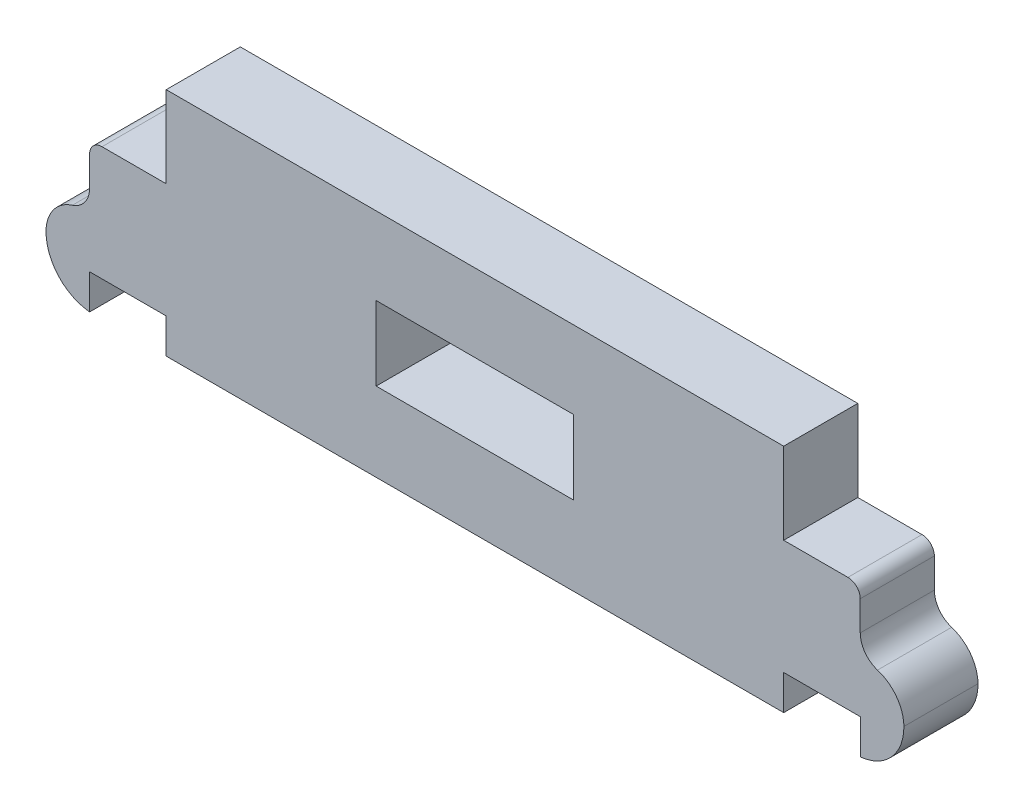
ISO-10303-21;
HEADER;
FILE_DESCRIPTION(('STEP AP214'),'2;1');
FILE_NAME('part.step','',(''),(''),'','','');
FILE_SCHEMA(('AUTOMOTIVE_DESIGN { 1 0 10303 214 1 1 1 1 }'));
ENDSEC;
DATA;
#1=APPLICATION_CONTEXT('core data for automotive mechanical design processes');
#2=APPLICATION_PROTOCOL_DEFINITION('international standard','automotive_design',2000,#1);
#3=PRODUCT_CONTEXT('',#1,'mechanical');
#4=PRODUCT('Part','Part','',(#3));
#5=PRODUCT_RELATED_PRODUCT_CATEGORY('part','',(#4));
#6=PRODUCT_DEFINITION_FORMATION('','',#4);
#7=PRODUCT_DEFINITION_CONTEXT('part definition',#1,'design');
#8=PRODUCT_DEFINITION('design','',#6,#7);
#9=PRODUCT_DEFINITION_SHAPE('','',#8);
#10=(LENGTH_UNIT() NAMED_UNIT(*) SI_UNIT(.MILLI.,.METRE.));
#11=(NAMED_UNIT(*) PLANE_ANGLE_UNIT() SI_UNIT($,.RADIAN.));
#12=(NAMED_UNIT(*) SI_UNIT($,.STERADIAN.) SOLID_ANGLE_UNIT());
#13=UNCERTAINTY_MEASURE_WITH_UNIT(LENGTH_MEASURE(1.E-05),#10,'distance_accuracy_value','');
#14=(GEOMETRIC_REPRESENTATION_CONTEXT(3) GLOBAL_UNCERTAINTY_ASSIGNED_CONTEXT((#13)) GLOBAL_UNIT_ASSIGNED_CONTEXT((#10,
#11,#12)) REPRESENTATION_CONTEXT('',''));
#15=CARTESIAN_POINT('',(0.,0.,0.));
#16=DIRECTION('',(0.,0.,1.));
#17=DIRECTION('',(1.,0.,0.));
#18=AXIS2_PLACEMENT_3D('',#15,#16,#17);
#19=CARTESIAN_POINT('',(1127.94350891643,1917.30650062035,-3.));
#20=DIRECTION('',(-1.,0.,0.));
#21=DIRECTION('',(0.,-1.,0.));
#22=AXIS2_PLACEMENT_3D('',#19,#20,#21);
#23=PLANE('',#22);
#24=DIRECTION('',(0.,-1.,0.));
#25=VECTOR('',#24,1.);
#26=CARTESIAN_POINT('',(1127.94350891643,1917.30650062035,0.));
#27=LINE('',#26,#25);
#28=CARTESIAN_POINT('',(1127.94350891643,1917.30650062035,0.));
#29=VERTEX_POINT('',#28);
#30=CARTESIAN_POINT('',(1127.94350891643,1914.00650062035,0.));
#31=VERTEX_POINT('',#30);
#32=EDGE_CURVE('E243',#29,#31,#27,.T.);
#33=ORIENTED_EDGE('',*,*,#32,.F.);
#34=DIRECTION('',(0.,0.,1.));
#35=VECTOR('',#34,1.);
#36=CARTESIAN_POINT('',(1127.94350891643,1917.30650062035,-3.));
#37=LINE('',#36,#35);
#38=CARTESIAN_POINT('',(1127.94350891643,1917.30650062035,-3.));
#39=VERTEX_POINT('',#38);
#40=EDGE_CURVE('E11',#39,#29,#37,.T.);
#41=ORIENTED_EDGE('',*,*,#40,.F.);
#42=DIRECTION('',(0.,-1.,0.));
#43=VECTOR('',#42,1.);
#44=CARTESIAN_POINT('',(1127.94350891643,1917.30650062035,-3.));
#45=LINE('',#44,#43);
#46=CARTESIAN_POINT('',(1127.94350891643,1914.00650062035,-3.));
#47=VERTEX_POINT('',#46);
#48=EDGE_CURVE('E247',#39,#47,#45,.T.);
#49=ORIENTED_EDGE('',*,*,#48,.T.);
#50=DIRECTION('',(0.,0.,1.));
#51=VECTOR('',#50,1.);
#52=CARTESIAN_POINT('',(1127.94350891643,1914.00650062035,-3.));
#53=LINE('',#52,#51);
#54=EDGE_CURVE('E40',#47,#31,#53,.T.);
#55=ORIENTED_EDGE('',*,*,#54,.T.);
#56=EDGE_LOOP('',(#33,#41,#49,#55));
#57=FACE_BOUND('',#56,.T.);
#58=ADVANCED_FACE('F37',(#57),#23,.T.);
#59=CARTESIAN_POINT('',(1127.94350891643,1917.30650062035,-3.));
#60=DIRECTION('',(0.,1.,0.));
#61=DIRECTION('',(-1.,0.,0.));
#62=AXIS2_PLACEMENT_3D('',#59,#60,#61);
#63=PLANE('',#62);
#64=DIRECTION('',(-1.,0.,0.));
#65=VECTOR('',#64,1.);
#66=CARTESIAN_POINT('',(1127.94350891643,1917.30650062035,0.));
#67=LINE('',#66,#65);
#68=CARTESIAN_POINT('',(1152.94350891643,1917.30650062035,0.));
#69=VERTEX_POINT('',#68);
#70=EDGE_CURVE('E251',#69,#29,#67,.T.);
#71=ORIENTED_EDGE('',*,*,#70,.F.);
#72=DIRECTION('',(0.,0.,1.));
#73=VECTOR('',#72,1.);
#74=CARTESIAN_POINT('',(1152.94350891643,1917.30650062035,-3.));
#75=LINE('',#74,#73);
#76=CARTESIAN_POINT('',(1152.94350891643,1917.30650062035,-3.));
#77=VERTEX_POINT('',#76);
#78=EDGE_CURVE('E45',#77,#69,#75,.T.);
#79=ORIENTED_EDGE('',*,*,#78,.F.);
#80=DIRECTION('',(-1.,0.,0.));
#81=VECTOR('',#80,1.);
#82=CARTESIAN_POINT('',(1127.94350891643,1917.30650062035,-3.));
#83=LINE('',#82,#81);
#84=EDGE_CURVE('E311',#77,#39,#83,.T.);
#85=ORIENTED_EDGE('',*,*,#84,.T.);
#86=ORIENTED_EDGE('',*,*,#40,.T.);
#87=EDGE_LOOP('',(#71,#79,#85,#86));
#88=FACE_BOUND('',#87,.T.);
#89=ADVANCED_FACE('F428',(#88),#63,.T.);
#90=CARTESIAN_POINT('',(1152.94350891643,1917.30650062035,-3.));
#91=DIRECTION('',(1.,0.,0.));
#92=DIRECTION('',(0.,0.,-1.));
#93=AXIS2_PLACEMENT_3D('',#90,#91,#92);
#94=PLANE('',#93);
#95=DIRECTION('',(0.,1.,0.));
#96=VECTOR('',#95,1.);
#97=CARTESIAN_POINT('',(1152.94350891643,1917.30650062035,0.));
#98=LINE('',#97,#96);
#99=CARTESIAN_POINT('',(1152.94350891643,1914.00650062035,0.));
#100=VERTEX_POINT('',#99);
#101=EDGE_CURVE('E373',#100,#69,#98,.T.);
#102=ORIENTED_EDGE('',*,*,#101,.F.);
#103=DIRECTION('',(0.,0.,1.));
#104=VECTOR('',#103,1.);
#105=CARTESIAN_POINT('',(1152.94350891643,1914.00650062035,-3.));
#106=LINE('',#105,#104);
#107=CARTESIAN_POINT('',(1152.94350891643,1914.00650062035,-3.));
#108=VERTEX_POINT('',#107);
#109=EDGE_CURVE('E379',#108,#100,#106,.T.);
#110=ORIENTED_EDGE('',*,*,#109,.F.);
#111=DIRECTION('',(0.,1.,0.));
#112=VECTOR('',#111,1.);
#113=CARTESIAN_POINT('',(1152.94350891643,1917.30650062035,-3.));
#114=LINE('',#113,#112);
#115=EDGE_CURVE('E308',#108,#77,#114,.T.);
#116=ORIENTED_EDGE('',*,*,#115,.T.);
#117=ORIENTED_EDGE('',*,*,#78,.T.);
#118=EDGE_LOOP('',(#102,#110,#116,#117));
#119=FACE_BOUND('',#118,.T.);
#120=ADVANCED_FACE('F503',(#119),#94,.T.);
#121=CARTESIAN_POINT('',(1152.94350891643,1914.00650062035,-3.));
#122=DIRECTION('',(0.,1.,0.));
#123=DIRECTION('',(0.,0.,1.));
#124=AXIS2_PLACEMENT_3D('',#121,#122,#123);
#125=PLANE('',#124);
#126=DIRECTION('',(-1.,0.,0.));
#127=VECTOR('',#126,1.);
#128=CARTESIAN_POINT('',(1152.94350891643,1914.00650062035,0.));
#129=LINE('',#128,#127);
#130=CARTESIAN_POINT('',(1155.54275991038,1914.00650062035,0.));
#131=VERTEX_POINT('',#130);
#132=EDGE_CURVE('E370',#131,#100,#129,.T.);
#133=ORIENTED_EDGE('',*,*,#132,.F.);
#134=DIRECTION('',(0.,0.,1.));
#135=VECTOR('',#134,1.);
#136=CARTESIAN_POINT('',(1155.54275991038,1914.00650062035,-3.));
#137=LINE('',#136,#135);
#138=CARTESIAN_POINT('',(1155.54275991038,1914.00650062035,-3.));
#139=VERTEX_POINT('',#138);
#140=EDGE_CURVE('E381',#139,#131,#137,.T.);
#141=ORIENTED_EDGE('',*,*,#140,.F.);
#142=DIRECTION('',(-1.,0.,0.));
#143=VECTOR('',#142,1.);
#144=CARTESIAN_POINT('',(1152.94350891643,1914.00650062035,-3.));
#145=LINE('',#144,#143);
#146=EDGE_CURVE('E305',#139,#108,#145,.T.);
#147=ORIENTED_EDGE('',*,*,#146,.T.);
#148=ORIENTED_EDGE('',*,*,#109,.T.);
#149=EDGE_LOOP('',(#133,#141,#147,#148));
#150=FACE_BOUND('',#149,.T.);
#151=ADVANCED_FACE('F501',(#150),#125,.T.);
#152=CARTESIAN_POINT('',(1155.54275991038,1913.50650062035,-3.));
#153=DIRECTION('',(0.,0.,1.));
#154=DIRECTION('',(1.,0.,0.));
#155=AXIS2_PLACEMENT_3D('',#152,#153,#154);
#156=CYLINDRICAL_SURFACE('',#155,0.499999999999945);
#157=CARTESIAN_POINT('',(1155.54275991038,1913.50650062035,0.));
#158=DIRECTION('',(0.,0.,1.));
#159=DIRECTION('',(-1.,0.,0.));
#160=AXIS2_PLACEMENT_3D('',#157,#158,#159);
#161=CIRCLE('',#160,0.499999999999945);
#162=CARTESIAN_POINT('',(1156.04275991038,1913.50650062035,0.));
#163=VERTEX_POINT('',#162);
#164=EDGE_CURVE('E367',#163,#131,#161,.T.);
#165=ORIENTED_EDGE('',*,*,#164,.F.);
#166=DIRECTION('',(0.,0.,1.));
#167=VECTOR('',#166,1.);
#168=CARTESIAN_POINT('',(1156.04275991038,1913.50650062035,-3.));
#169=LINE('',#168,#167);
#170=CARTESIAN_POINT('',(1156.04275991038,1913.50650062035,-3.));
#171=VERTEX_POINT('',#170);
#172=EDGE_CURVE('E383',#171,#163,#169,.T.);
#173=ORIENTED_EDGE('',*,*,#172,.F.);
#174=CARTESIAN_POINT('',(1155.54275991038,1913.50650062035,-3.));
#175=DIRECTION('',(0.,0.,1.));
#176=DIRECTION('',(-1.,0.,0.));
#177=AXIS2_PLACEMENT_3D('',#174,#175,#176);
#178=CIRCLE('',#177,0.499999999999945);
#179=EDGE_CURVE('E302',#171,#139,#178,.T.);
#180=ORIENTED_EDGE('',*,*,#179,.T.);
#181=ORIENTED_EDGE('',*,*,#140,.T.);
#182=EDGE_LOOP('',(#165,#173,#180,#181));
#183=FACE_BOUND('',#182,.T.);
#184=ADVANCED_FACE('F497',(#183),#156,.T.);
#185=CARTESIAN_POINT('',(1156.04275991038,1913.50650062035,-3.));
#186=DIRECTION('',(1.,0.,0.));
#187=DIRECTION('',(0.,0.,-1.));
#188=AXIS2_PLACEMENT_3D('',#185,#186,#187);
#189=PLANE('',#188);
#190=DIRECTION('',(0.,1.,0.));
#191=VECTOR('',#190,1.);
#192=CARTESIAN_POINT('',(1156.04275991038,1913.50650062035,0.));
#193=LINE('',#192,#191);
#194=CARTESIAN_POINT('',(1156.04275991038,1912.3090901289,0.));
#195=VERTEX_POINT('',#194);
#196=EDGE_CURVE('E364',#195,#163,#193,.T.);
#197=ORIENTED_EDGE('',*,*,#196,.F.);
#198=DIRECTION('',(0.,0.,1.));
#199=VECTOR('',#198,1.);
#200=CARTESIAN_POINT('',(1156.04275991038,1912.3090901289,-3.));
#201=LINE('',#200,#199);
#202=CARTESIAN_POINT('',(1156.04275991038,1912.3090901289,-3.));
#203=VERTEX_POINT('',#202);
#204=EDGE_CURVE('E385',#203,#195,#201,.T.);
#205=ORIENTED_EDGE('',*,*,#204,.F.);
#206=DIRECTION('',(0.,1.,0.));
#207=VECTOR('',#206,1.);
#208=CARTESIAN_POINT('',(1156.04275991038,1913.50650062035,-3.));
#209=LINE('',#208,#207);
#210=EDGE_CURVE('E299',#203,#171,#209,.T.);
#211=ORIENTED_EDGE('',*,*,#210,.T.);
#212=ORIENTED_EDGE('',*,*,#172,.T.);
#213=EDGE_LOOP('',(#197,#205,#211,#212));
#214=FACE_BOUND('',#213,.T.);
#215=ADVANCED_FACE('F493',(#214),#189,.T.);
#216=CARTESIAN_POINT('',(1157.04275991038,1912.3090901289,-3.));
#217=DIRECTION('',(0.,0.,1.));
#218=DIRECTION('',(1.,0.,0.));
#219=AXIS2_PLACEMENT_3D('',#216,#217,#218);
#220=CYLINDRICAL_SURFACE('',#219,1.);
#221=CARTESIAN_POINT('',(1157.04275991038,1912.3090901289,0.));
#222=DIRECTION('',(0.,0.,-1.));
#223=DIRECTION('',(1.,0.,0.));
#224=AXIS2_PLACEMENT_3D('',#221,#222,#223);
#225=CIRCLE('',#224,1.);
#226=CARTESIAN_POINT('',(1156.74243530139,1911.35525307298,0.));
#227=VERTEX_POINT('',#226);
#228=EDGE_CURVE('E361',#227,#195,#225,.T.);
#229=ORIENTED_EDGE('',*,*,#228,.F.);
#230=DIRECTION('',(0.,0.,1.));
#231=VECTOR('',#230,1.);
#232=CARTESIAN_POINT('',(1156.74243530139,1911.35525307298,-3.));
#233=LINE('',#232,#231);
#234=CARTESIAN_POINT('',(1156.74243530139,1911.35525307298,-3.));
#235=VERTEX_POINT('',#234);
#236=EDGE_CURVE('E387',#235,#227,#233,.T.);
#237=ORIENTED_EDGE('',*,*,#236,.F.);
#238=CARTESIAN_POINT('',(1157.04275991038,1912.3090901289,-3.));
#239=DIRECTION('',(0.,0.,-1.));
#240=DIRECTION('',(1.,0.,0.));
#241=AXIS2_PLACEMENT_3D('',#238,#239,#240);
#242=CIRCLE('',#241,1.);
#243=EDGE_CURVE('E296',#235,#203,#242,.T.);
#244=ORIENTED_EDGE('',*,*,#243,.T.);
#245=ORIENTED_EDGE('',*,*,#204,.T.);
#246=EDGE_LOOP('',(#229,#237,#244,#245));
#247=FACE_BOUND('',#246,.T.);
#248=ADVANCED_FACE('F489',(#247),#220,.F.);
#249=CARTESIAN_POINT('',(1156.28409963789,1909.89956969972,-3.));
#250=DIRECTION('',(0.,0.,1.));
#251=DIRECTION('',(1.,0.,0.));
#252=AXIS2_PLACEMENT_3D('',#249,#250,#251);
#253=CYLINDRICAL_SURFACE('',#252,1.52613422202469);
#254=CARTESIAN_POINT('',(1156.28409963789,1909.89956969972,0.));
#255=DIRECTION('',(0.,0.,1.));
#256=DIRECTION('',(-1.,0.,0.));
#257=AXIS2_PLACEMENT_3D('',#254,#255,#256);
#258=CIRCLE('',#257,1.52613422202469);
#259=CARTESIAN_POINT('',(1157.810195296,1909.91041893606,0.));
#260=VERTEX_POINT('',#259);
#261=EDGE_CURVE('E358',#260,#227,#258,.T.);
#262=ORIENTED_EDGE('',*,*,#261,.F.);
#263=DIRECTION('',(0.,0.,1.));
#264=VECTOR('',#263,1.);
#265=CARTESIAN_POINT('',(1157.810195296,1909.91041893606,-3.));
#266=LINE('',#265,#264);
#267=CARTESIAN_POINT('',(1157.810195296,1909.91041893606,-3.));
#268=VERTEX_POINT('',#267);
#269=EDGE_CURVE('E389',#268,#260,#266,.T.);
#270=ORIENTED_EDGE('',*,*,#269,.F.);
#271=CARTESIAN_POINT('',(1156.28409963789,1909.89956969972,-3.));
#272=DIRECTION('',(0.,0.,1.));
#273=DIRECTION('',(-1.,0.,0.));
#274=AXIS2_PLACEMENT_3D('',#271,#272,#273);
#275=CIRCLE('',#274,1.52613422202469);
#276=EDGE_CURVE('E293',#268,#235,#275,.T.);
#277=ORIENTED_EDGE('',*,*,#276,.T.);
#278=ORIENTED_EDGE('',*,*,#236,.T.);
#279=EDGE_LOOP('',(#262,#270,#277,#278));
#280=FACE_BOUND('',#279,.T.);
#281=ADVANCED_FACE('F485',(#280),#253,.T.);
#282=CARTESIAN_POINT('',(1155.86853477585,1909.89661538858,-3.));
#283=DIRECTION('',(0.,0.,1.));
#284=DIRECTION('',(1.,0.,0.));
#285=AXIS2_PLACEMENT_3D('',#282,#283,#284);
#286=CYLINDRICAL_SURFACE('',#285,1.94170958525303);
#287=CARTESIAN_POINT('',(1155.86853477585,1909.89661538858,0.));
#288=DIRECTION('',(0.,0.,1.));
#289=DIRECTION('',(-1.,0.,0.));
#290=AXIS2_PLACEMENT_3D('',#287,#288,#289);
#291=CIRCLE('',#290,1.94170958525303);
#292=CARTESIAN_POINT('',(1156.04350891643,1907.96280563486,0.));
#293=VERTEX_POINT('',#292);
#294=EDGE_CURVE('E355',#293,#260,#291,.T.);
#295=ORIENTED_EDGE('',*,*,#294,.F.);
#296=DIRECTION('',(0.,0.,1.));
#297=VECTOR('',#296,1.);
#298=CARTESIAN_POINT('',(1156.04350891643,1907.96280563486,-3.));
#299=LINE('',#298,#297);
#300=CARTESIAN_POINT('',(1156.04350891643,1907.96280563486,-3.));
#301=VERTEX_POINT('',#300);
#302=EDGE_CURVE('E391',#301,#293,#299,.T.);
#303=ORIENTED_EDGE('',*,*,#302,.F.);
#304=CARTESIAN_POINT('',(1155.86853477585,1909.89661538858,-3.));
#305=DIRECTION('',(0.,0.,1.));
#306=DIRECTION('',(-1.,0.,0.));
#307=AXIS2_PLACEMENT_3D('',#304,#305,#306);
#308=CIRCLE('',#307,1.94170958525303);
#309=EDGE_CURVE('E290',#301,#268,#308,.T.);
#310=ORIENTED_EDGE('',*,*,#309,.T.);
#311=ORIENTED_EDGE('',*,*,#269,.T.);
#312=EDGE_LOOP('',(#295,#303,#310,#311));
#313=FACE_BOUND('',#312,.T.);
#314=ADVANCED_FACE('F481',(#313),#286,.T.);
#315=CARTESIAN_POINT('',(1156.04350891643,1909.37141695844,-3.));
#316=DIRECTION('',(-1.,0.,0.));
#317=DIRECTION('',(0.,0.,1.));
#318=AXIS2_PLACEMENT_3D('',#315,#316,#317);
#319=PLANE('',#318);
#320=DIRECTION('',(0.,-1.,0.));
#321=VECTOR('',#320,1.);
#322=CARTESIAN_POINT('',(1156.04350891643,1909.37141695844,0.));
#323=LINE('',#322,#321);
#324=CARTESIAN_POINT('',(1156.04350891643,1909.37141695844,0.));
#325=VERTEX_POINT('',#324);
#326=EDGE_CURVE('E352',#325,#293,#323,.T.);
#327=ORIENTED_EDGE('',*,*,#326,.F.);
#328=DIRECTION('',(0.,0.,1.));
#329=VECTOR('',#328,1.);
#330=CARTESIAN_POINT('',(1156.04350891643,1909.37141695844,-3.));
#331=LINE('',#330,#329);
#332=CARTESIAN_POINT('',(1156.04350891643,1909.37141695844,-3.));
#333=VERTEX_POINT('',#332);
#334=EDGE_CURVE('E393',#333,#325,#331,.T.);
#335=ORIENTED_EDGE('',*,*,#334,.F.);
#336=DIRECTION('',(0.,-1.,0.));
#337=VECTOR('',#336,1.);
#338=CARTESIAN_POINT('',(1156.04350891643,1909.37141695844,-3.));
#339=LINE('',#338,#337);
#340=EDGE_CURVE('E287',#333,#301,#339,.T.);
#341=ORIENTED_EDGE('',*,*,#340,.T.);
#342=ORIENTED_EDGE('',*,*,#302,.T.);
#343=EDGE_LOOP('',(#327,#335,#341,#342));
#344=FACE_BOUND('',#343,.T.);
#345=ADVANCED_FACE('F477',(#344),#319,.T.);
#346=CARTESIAN_POINT('',(1156.04350891643,1909.37141695844,-3.));
#347=DIRECTION('',(0.,-1.,0.));
#348=DIRECTION('',(0.,0.,-1.));
#349=AXIS2_PLACEMENT_3D('',#346,#347,#348);
#350=PLANE('',#349);
#351=DIRECTION('',(1.,0.,0.));
#352=VECTOR('',#351,1.);
#353=CARTESIAN_POINT('',(1156.04350891643,1909.37141695844,0.));
#354=LINE('',#353,#352);
#355=CARTESIAN_POINT('',(1152.94350891643,1909.37141695844,0.));
#356=VERTEX_POINT('',#355);
#357=EDGE_CURVE('E349',#356,#325,#354,.T.);
#358=ORIENTED_EDGE('',*,*,#357,.F.);
#359=DIRECTION('',(0.,0.,1.));
#360=VECTOR('',#359,1.);
#361=CARTESIAN_POINT('',(1152.94350891643,1909.37141695844,-3.));
#362=LINE('',#361,#360);
#363=CARTESIAN_POINT('',(1152.94350891643,1909.37141695844,-3.));
#364=VERTEX_POINT('',#363);
#365=EDGE_CURVE('E395',#364,#356,#362,.T.);
#366=ORIENTED_EDGE('',*,*,#365,.F.);
#367=DIRECTION('',(1.,0.,0.));
#368=VECTOR('',#367,1.);
#369=CARTESIAN_POINT('',(1156.04350891643,1909.37141695844,-3.));
#370=LINE('',#369,#368);
#371=EDGE_CURVE('E284',#364,#333,#370,.T.);
#372=ORIENTED_EDGE('',*,*,#371,.T.);
#373=ORIENTED_EDGE('',*,*,#334,.T.);
#374=EDGE_LOOP('',(#358,#366,#372,#373));
#375=FACE_BOUND('',#374,.T.);
#376=ADVANCED_FACE('F473',(#375),#350,.T.);
#377=CARTESIAN_POINT('',(1152.94350891643,1909.37141695844,-3.));
#378=DIRECTION('',(1.,0.,0.));
#379=DIRECTION('',(0.,0.,-1.));
#380=AXIS2_PLACEMENT_3D('',#377,#378,#379);
#381=PLANE('',#380);
#382=DIRECTION('',(0.,1.,0.));
#383=VECTOR('',#382,1.);
#384=CARTESIAN_POINT('',(1152.94350891643,1909.37141695844,0.));
#385=LINE('',#384,#383);
#386=CARTESIAN_POINT('',(1152.94350891643,1907.96280563486,0.));
#387=VERTEX_POINT('',#386);
#388=EDGE_CURVE('E346',#387,#356,#385,.T.);
#389=ORIENTED_EDGE('',*,*,#388,.F.);
#390=DIRECTION('',(0.,0.,1.));
#391=VECTOR('',#390,1.);
#392=CARTESIAN_POINT('',(1152.94350891643,1907.96280563486,-3.));
#393=LINE('',#392,#391);
#394=CARTESIAN_POINT('',(1152.94350891643,1907.96280563486,-3.));
#395=VERTEX_POINT('',#394);
#396=EDGE_CURVE('E397',#395,#387,#393,.T.);
#397=ORIENTED_EDGE('',*,*,#396,.F.);
#398=DIRECTION('',(0.,1.,0.));
#399=VECTOR('',#398,1.);
#400=CARTESIAN_POINT('',(1152.94350891643,1909.37141695844,-3.));
#401=LINE('',#400,#399);
#402=EDGE_CURVE('E281',#395,#364,#401,.T.);
#403=ORIENTED_EDGE('',*,*,#402,.T.);
#404=ORIENTED_EDGE('',*,*,#365,.T.);
#405=EDGE_LOOP('',(#389,#397,#403,#404));
#406=FACE_BOUND('',#405,.T.);
#407=ADVANCED_FACE('F469',(#406),#381,.T.);
#408=CARTESIAN_POINT('',(1152.94350891643,1907.96280563486,-3.));
#409=DIRECTION('',(0.,-1.,0.));
#410=DIRECTION('',(0.,0.,-1.));
#411=AXIS2_PLACEMENT_3D('',#408,#409,#410);
#412=PLANE('',#411);
#413=DIRECTION('',(1.,0.,0.));
#414=VECTOR('',#413,1.);
#415=CARTESIAN_POINT('',(1152.94350891643,1907.96280563486,0.));
#416=LINE('',#415,#414);
#417=CARTESIAN_POINT('',(1127.94350891643,1907.96280563486,0.));
#418=VERTEX_POINT('',#417);
#419=EDGE_CURVE('E343',#418,#387,#416,.T.);
#420=ORIENTED_EDGE('',*,*,#419,.F.);
#421=DIRECTION('',(0.,0.,1.));
#422=VECTOR('',#421,1.);
#423=CARTESIAN_POINT('',(1127.94350891643,1907.96280563486,-3.));
#424=LINE('',#423,#422);
#425=CARTESIAN_POINT('',(1127.94350891643,1907.96280563486,-3.));
#426=VERTEX_POINT('',#425);
#427=EDGE_CURVE('E399',#426,#418,#424,.T.);
#428=ORIENTED_EDGE('',*,*,#427,.F.);
#429=DIRECTION('',(1.,0.,0.));
#430=VECTOR('',#429,1.);
#431=CARTESIAN_POINT('',(1152.94350891643,1907.96280563486,-3.));
#432=LINE('',#431,#430);
#433=EDGE_CURVE('E278',#426,#395,#432,.T.);
#434=ORIENTED_EDGE('',*,*,#433,.T.);
#435=ORIENTED_EDGE('',*,*,#396,.T.);
#436=EDGE_LOOP('',(#420,#428,#434,#435));
#437=FACE_BOUND('',#436,.T.);
#438=ADVANCED_FACE('F465',(#437),#412,.T.);
#439=CARTESIAN_POINT('',(1127.94350891643,1909.37141695844,-3.));
#440=DIRECTION('',(-1.,0.,0.));
#441=DIRECTION('',(0.,0.,1.));
#442=AXIS2_PLACEMENT_3D('',#439,#440,#441);
#443=PLANE('',#442);
#444=DIRECTION('',(0.,-1.,0.));
#445=VECTOR('',#444,1.);
#446=CARTESIAN_POINT('',(1127.94350891643,1909.37141695844,0.));
#447=LINE('',#446,#445);
#448=CARTESIAN_POINT('',(1127.94350891643,1909.37141695844,0.));
#449=VERTEX_POINT('',#448);
#450=EDGE_CURVE('E340',#449,#418,#447,.T.);
#451=ORIENTED_EDGE('',*,*,#450,.F.);
#452=DIRECTION('',(0.,0.,1.));
#453=VECTOR('',#452,1.);
#454=CARTESIAN_POINT('',(1127.94350891643,1909.37141695844,-3.));
#455=LINE('',#454,#453);
#456=CARTESIAN_POINT('',(1127.94350891643,1909.37141695844,-3.));
#457=VERTEX_POINT('',#456);
#458=EDGE_CURVE('E401',#457,#449,#455,.T.);
#459=ORIENTED_EDGE('',*,*,#458,.F.);
#460=DIRECTION('',(0.,-1.,0.));
#461=VECTOR('',#460,1.);
#462=CARTESIAN_POINT('',(1127.94350891643,1909.37141695844,-3.));
#463=LINE('',#462,#461);
#464=EDGE_CURVE('E275',#457,#426,#463,.T.);
#465=ORIENTED_EDGE('',*,*,#464,.T.);
#466=ORIENTED_EDGE('',*,*,#427,.T.);
#467=EDGE_LOOP('',(#451,#459,#465,#466));
#468=FACE_BOUND('',#467,.T.);
#469=ADVANCED_FACE('F461',(#468),#443,.T.);
#470=CARTESIAN_POINT('',(1124.84350891643,1909.37141695844,-3.));
#471=DIRECTION('',(0.,-1.,0.));
#472=DIRECTION('',(0.,0.,-1.));
#473=AXIS2_PLACEMENT_3D('',#470,#471,#472);
#474=PLANE('',#473);
#475=DIRECTION('',(1.,0.,0.));
#476=VECTOR('',#475,1.);
#477=CARTESIAN_POINT('',(1124.84350891643,1909.37141695844,0.));
#478=LINE('',#477,#476);
#479=CARTESIAN_POINT('',(1124.84350891643,1909.37141695844,0.));
#480=VERTEX_POINT('',#479);
#481=EDGE_CURVE('E337',#480,#449,#478,.T.);
#482=ORIENTED_EDGE('',*,*,#481,.F.);
#483=DIRECTION('',(0.,0.,1.));
#484=VECTOR('',#483,1.);
#485=CARTESIAN_POINT('',(1124.84350891643,1909.37141695844,-3.));
#486=LINE('',#485,#484);
#487=CARTESIAN_POINT('',(1124.84350891643,1909.37141695844,-3.));
#488=VERTEX_POINT('',#487);
#489=EDGE_CURVE('E403',#488,#480,#486,.T.);
#490=ORIENTED_EDGE('',*,*,#489,.F.);
#491=DIRECTION('',(1.,0.,0.));
#492=VECTOR('',#491,1.);
#493=CARTESIAN_POINT('',(1124.84350891643,1909.37141695844,-3.));
#494=LINE('',#493,#492);
#495=EDGE_CURVE('E272',#488,#457,#494,.T.);
#496=ORIENTED_EDGE('',*,*,#495,.T.);
#497=ORIENTED_EDGE('',*,*,#458,.T.);
#498=EDGE_LOOP('',(#482,#490,#496,#497));
#499=FACE_BOUND('',#498,.T.);
#500=ADVANCED_FACE('F457',(#499),#474,.T.);
#501=CARTESIAN_POINT('',(1124.84350891643,1909.37141695844,-3.));
#502=DIRECTION('',(1.,0.,0.));
#503=DIRECTION('',(0.,0.,-1.));
#504=AXIS2_PLACEMENT_3D('',#501,#502,#503);
#505=PLANE('',#504);
#506=DIRECTION('',(0.,1.,0.));
#507=VECTOR('',#506,1.);
#508=CARTESIAN_POINT('',(1124.84350891643,1909.37141695844,0.));
#509=LINE('',#508,#507);
#510=CARTESIAN_POINT('',(1124.84350891643,1907.96280563486,0.));
#511=VERTEX_POINT('',#510);
#512=EDGE_CURVE('E334',#511,#480,#509,.T.);
#513=ORIENTED_EDGE('',*,*,#512,.F.);
#514=DIRECTION('',(0.,0.,1.));
#515=VECTOR('',#514,1.);
#516=CARTESIAN_POINT('',(1124.84350891643,1907.96280563486,-3.));
#517=LINE('',#516,#515);
#518=CARTESIAN_POINT('',(1124.84350891643,1907.96280563486,-3.));
#519=VERTEX_POINT('',#518);
#520=EDGE_CURVE('E405',#519,#511,#517,.T.);
#521=ORIENTED_EDGE('',*,*,#520,.F.);
#522=DIRECTION('',(0.,1.,0.));
#523=VECTOR('',#522,1.);
#524=CARTESIAN_POINT('',(1124.84350891643,1909.37141695844,-3.));
#525=LINE('',#524,#523);
#526=EDGE_CURVE('E269',#519,#488,#525,.T.);
#527=ORIENTED_EDGE('',*,*,#526,.T.);
#528=ORIENTED_EDGE('',*,*,#489,.T.);
#529=EDGE_LOOP('',(#513,#521,#527,#528));
#530=FACE_BOUND('',#529,.T.);
#531=ADVANCED_FACE('F453',(#530),#505,.T.);
#532=CARTESIAN_POINT('',(1125.01848305702,1909.89661538858,-3.));
#533=DIRECTION('',(0.,0.,1.));
#534=DIRECTION('',(1.,0.,0.));
#535=AXIS2_PLACEMENT_3D('',#532,#533,#534);
#536=CYLINDRICAL_SURFACE('',#535,1.94170958525303);
#537=CARTESIAN_POINT('',(1125.01848305702,1909.89661538858,0.));
#538=DIRECTION('',(0.,0.,1.));
#539=DIRECTION('',(1.,0.,0.));
#540=AXIS2_PLACEMENT_3D('',#537,#538,#539);
#541=CIRCLE('',#540,1.94170958525303);
#542=CARTESIAN_POINT('',(1123.07682253686,1909.91041893606,0.));
#543=VERTEX_POINT('',#542);
#544=EDGE_CURVE('E331',#543,#511,#541,.T.);
#545=ORIENTED_EDGE('',*,*,#544,.F.);
#546=DIRECTION('',(0.,0.,1.));
#547=VECTOR('',#546,1.);
#548=CARTESIAN_POINT('',(1123.07682253686,1909.91041893606,-3.));
#549=LINE('',#548,#547);
#550=CARTESIAN_POINT('',(1123.07682253686,1909.91041893606,-3.));
#551=VERTEX_POINT('',#550);
#552=EDGE_CURVE('E407',#551,#543,#549,.T.);
#553=ORIENTED_EDGE('',*,*,#552,.F.);
#554=CARTESIAN_POINT('',(1125.01848305702,1909.89661538858,-3.));
#555=DIRECTION('',(0.,0.,1.));
#556=DIRECTION('',(1.,0.,0.));
#557=AXIS2_PLACEMENT_3D('',#554,#555,#556);
#558=CIRCLE('',#557,1.94170958525303);
#559=EDGE_CURVE('E266',#551,#519,#558,.T.);
#560=ORIENTED_EDGE('',*,*,#559,.T.);
#561=ORIENTED_EDGE('',*,*,#520,.T.);
#562=EDGE_LOOP('',(#545,#553,#560,#561));
#563=FACE_BOUND('',#562,.T.);
#564=ADVANCED_FACE('F449',(#563),#536,.T.);
#565=CARTESIAN_POINT('',(1124.60291819498,1909.89956969972,-3.));
#566=DIRECTION('',(0.,0.,1.));
#567=DIRECTION('',(1.,0.,0.));
#568=AXIS2_PLACEMENT_3D('',#565,#566,#567);
#569=CYLINDRICAL_SURFACE('',#568,1.5261342220248);
#570=CARTESIAN_POINT('',(1124.60291819498,1909.89956969972,0.));
#571=DIRECTION('',(0.,0.,1.));
#572=DIRECTION('',(1.,0.,0.));
#573=AXIS2_PLACEMENT_3D('',#570,#571,#572);
#574=CIRCLE('',#573,1.5261342220248);
#575=CARTESIAN_POINT('',(1124.14458253148,1911.35525307298,0.));
#576=VERTEX_POINT('',#575);
#577=EDGE_CURVE('E328',#576,#543,#574,.T.);
#578=ORIENTED_EDGE('',*,*,#577,.F.);
#579=DIRECTION('',(0.,0.,1.));
#580=VECTOR('',#579,1.);
#581=CARTESIAN_POINT('',(1124.14458253148,1911.35525307298,-3.));
#582=LINE('',#581,#580);
#583=CARTESIAN_POINT('',(1124.14458253148,1911.35525307298,-3.));
#584=VERTEX_POINT('',#583);
#585=EDGE_CURVE('E409',#584,#576,#582,.T.);
#586=ORIENTED_EDGE('',*,*,#585,.F.);
#587=CARTESIAN_POINT('',(1124.60291819498,1909.89956969972,-3.));
#588=DIRECTION('',(0.,0.,1.));
#589=DIRECTION('',(1.,0.,0.));
#590=AXIS2_PLACEMENT_3D('',#587,#588,#589);
#591=CIRCLE('',#590,1.5261342220248);
#592=EDGE_CURVE('E263',#584,#551,#591,.T.);
#593=ORIENTED_EDGE('',*,*,#592,.T.);
#594=ORIENTED_EDGE('',*,*,#552,.T.);
#595=EDGE_LOOP('',(#578,#586,#593,#594));
#596=FACE_BOUND('',#595,.T.);
#597=ADVANCED_FACE('F445',(#596),#569,.T.);
#598=CARTESIAN_POINT('',(1123.84425792249,1912.3090901289,-3.));
#599=DIRECTION('',(0.,0.,1.));
#600=DIRECTION('',(1.,0.,0.));
#601=AXIS2_PLACEMENT_3D('',#598,#599,#600);
#602=CYLINDRICAL_SURFACE('',#601,0.999999999999865);
#603=CARTESIAN_POINT('',(1123.84425792249,1912.3090901289,0.));
#604=DIRECTION('',(0.,0.,-1.));
#605=DIRECTION('',(1.,0.,0.));
#606=AXIS2_PLACEMENT_3D('',#603,#604,#605);
#607=CIRCLE('',#606,0.999999999999865);
#608=CARTESIAN_POINT('',(1124.84425792249,1912.3090901289,0.));
#609=VERTEX_POINT('',#608);
#610=EDGE_CURVE('E325',#609,#576,#607,.T.);
#611=ORIENTED_EDGE('',*,*,#610,.F.);
#612=DIRECTION('',(0.,0.,1.));
#613=VECTOR('',#612,1.);
#614=CARTESIAN_POINT('',(1124.84425792249,1912.3090901289,-3.));
#615=LINE('',#614,#613);
#616=CARTESIAN_POINT('',(1124.84425792249,1912.3090901289,-3.));
#617=VERTEX_POINT('',#616);
#618=EDGE_CURVE('E411',#617,#609,#615,.T.);
#619=ORIENTED_EDGE('',*,*,#618,.F.);
#620=CARTESIAN_POINT('',(1123.84425792249,1912.3090901289,-3.));
#621=DIRECTION('',(0.,0.,-1.));
#622=DIRECTION('',(1.,0.,0.));
#623=AXIS2_PLACEMENT_3D('',#620,#621,#622);
#624=CIRCLE('',#623,0.999999999999865);
#625=EDGE_CURVE('E260',#617,#584,#624,.T.);
#626=ORIENTED_EDGE('',*,*,#625,.T.);
#627=ORIENTED_EDGE('',*,*,#585,.T.);
#628=EDGE_LOOP('',(#611,#619,#626,#627));
#629=FACE_BOUND('',#628,.T.);
#630=ADVANCED_FACE('F441',(#629),#602,.F.);
#631=CARTESIAN_POINT('',(1124.84425792249,1913.50650062035,-3.));
#632=DIRECTION('',(-1.,0.,0.));
#633=DIRECTION('',(0.,0.,1.));
#634=AXIS2_PLACEMENT_3D('',#631,#632,#633);
#635=PLANE('',#634);
#636=DIRECTION('',(0.,-1.,0.));
#637=VECTOR('',#636,1.);
#638=CARTESIAN_POINT('',(1124.84425792249,1913.50650062035,0.));
#639=LINE('',#638,#637);
#640=CARTESIAN_POINT('',(1124.84425792249,1913.50650062035,0.));
#641=VERTEX_POINT('',#640);
#642=EDGE_CURVE('E322',#641,#609,#639,.T.);
#643=ORIENTED_EDGE('',*,*,#642,.F.);
#644=DIRECTION('',(0.,0.,1.));
#645=VECTOR('',#644,1.);
#646=CARTESIAN_POINT('',(1124.84425792249,1913.50650062035,-3.));
#647=LINE('',#646,#645);
#648=CARTESIAN_POINT('',(1124.84425792249,1913.50650062035,-3.));
#649=VERTEX_POINT('',#648);
#650=EDGE_CURVE('E413',#649,#641,#647,.T.);
#651=ORIENTED_EDGE('',*,*,#650,.F.);
#652=DIRECTION('',(0.,-1.,0.));
#653=VECTOR('',#652,1.);
#654=CARTESIAN_POINT('',(1124.84425792249,1913.50650062035,-3.));
#655=LINE('',#654,#653);
#656=EDGE_CURVE('E257',#649,#617,#655,.T.);
#657=ORIENTED_EDGE('',*,*,#656,.T.);
#658=ORIENTED_EDGE('',*,*,#618,.T.);
#659=EDGE_LOOP('',(#643,#651,#657,#658));
#660=FACE_BOUND('',#659,.T.);
#661=ADVANCED_FACE('F439',(#660),#635,.T.);
#662=CARTESIAN_POINT('',(1125.34425792249,1913.50650062035,-3.));
#663=DIRECTION('',(0.,0.,1.));
#664=DIRECTION('',(1.,0.,0.));
#665=AXIS2_PLACEMENT_3D('',#662,#663,#664);
#666=CYLINDRICAL_SURFACE('',#665,0.499999999999945);
#667=CARTESIAN_POINT('',(1125.34425792249,1913.50650062035,0.));
#668=DIRECTION('',(0.,0.,1.));
#669=DIRECTION('',(-1.,0.,0.));
#670=AXIS2_PLACEMENT_3D('',#667,#668,#669);
#671=CIRCLE('',#670,0.499999999999945);
#672=CARTESIAN_POINT('',(1125.34425792249,1914.00650062035,0.));
#673=VERTEX_POINT('',#672);
#674=EDGE_CURVE('E319',#673,#641,#671,.T.);
#675=ORIENTED_EDGE('',*,*,#674,.F.);
#676=DIRECTION('',(0.,0.,1.));
#677=VECTOR('',#676,1.);
#678=CARTESIAN_POINT('',(1125.34425792249,1914.00650062035,-3.));
#679=LINE('',#678,#677);
#680=CARTESIAN_POINT('',(1125.34425792249,1914.00650062035,-3.));
#681=VERTEX_POINT('',#680);
#682=EDGE_CURVE('E414',#681,#673,#679,.T.);
#683=ORIENTED_EDGE('',*,*,#682,.F.);
#684=CARTESIAN_POINT('',(1125.34425792249,1913.50650062035,-3.));
#685=DIRECTION('',(0.,0.,1.));
#686=DIRECTION('',(-1.,0.,0.));
#687=AXIS2_PLACEMENT_3D('',#684,#685,#686);
#688=CIRCLE('',#687,0.499999999999945);
#689=EDGE_CURVE('E254',#681,#649,#688,.T.);
#690=ORIENTED_EDGE('',*,*,#689,.T.);
#691=ORIENTED_EDGE('',*,*,#650,.T.);
#692=EDGE_LOOP('',(#675,#683,#690,#691));
#693=FACE_BOUND('',#692,.T.);
#694=ADVANCED_FACE('F435',(#693),#666,.T.);
#695=CARTESIAN_POINT('',(1127.94350891643,1914.00650062035,-3.));
#696=DIRECTION('',(0.,1.,0.));
#697=DIRECTION('',(0.,0.,1.));
#698=AXIS2_PLACEMENT_3D('',#695,#696,#697);
#699=PLANE('',#698);
#700=DIRECTION('',(-1.,0.,0.));
#701=VECTOR('',#700,1.);
#702=CARTESIAN_POINT('',(1127.94350891643,1914.00650062035,0.));
#703=LINE('',#702,#701);
#704=EDGE_CURVE('E316',#31,#673,#703,.T.);
#705=ORIENTED_EDGE('',*,*,#704,.F.);
#706=ORIENTED_EDGE('',*,*,#54,.F.);
#707=DIRECTION('',(-1.,0.,0.));
#708=VECTOR('',#707,1.);
#709=CARTESIAN_POINT('',(1127.94350891643,1914.00650062035,-3.));
#710=LINE('',#709,#708);
#711=EDGE_CURVE('E250',#47,#681,#710,.T.);
#712=ORIENTED_EDGE('',*,*,#711,.T.);
#713=ORIENTED_EDGE('',*,*,#682,.T.);
#714=EDGE_LOOP('',(#705,#706,#712,#713));
#715=FACE_BOUND('',#714,.T.);
#716=ADVANCED_FACE('F422',(#715),#699,.T.);
#717=CARTESIAN_POINT('',(1125.34425792249,1913.50650062035,-3.));
#718=DIRECTION('',(0.,0.,-1.));
#719=DIRECTION('',(-1.,0.,0.));
#720=AXIS2_PLACEMENT_3D('',#717,#718,#719);
#721=PLANE('',#720);
#722=DIRECTION('',(0.,-1.,0.));
#723=VECTOR('',#722,1.);
#724=CARTESIAN_POINT('',(1136.44350891643,1914.16280563486,-3.));
#725=LINE('',#724,#723);
#726=CARTESIAN_POINT('',(1136.44350891643,1914.16280563486,-3.));
#727=VERTEX_POINT('',#726);
#728=CARTESIAN_POINT('',(1136.44350891643,1911.16280563486,-3.));
#729=VERTEX_POINT('',#728);
#730=EDGE_CURVE('E212',#727,#729,#725,.T.);
#731=ORIENTED_EDGE('',*,*,#730,.T.);
#732=DIRECTION('',(1.,0.,0.));
#733=VECTOR('',#732,1.);
#734=CARTESIAN_POINT('',(1136.44350891643,1911.16280563486,-3.));
#735=LINE('',#734,#733);
#736=CARTESIAN_POINT('',(1144.44350891643,1911.16280563486,-3.));
#737=VERTEX_POINT('',#736);
#738=EDGE_CURVE('E221',#729,#737,#735,.T.);
#739=ORIENTED_EDGE('',*,*,#738,.T.);
#740=DIRECTION('',(0.,1.,0.));
#741=VECTOR('',#740,1.);
#742=CARTESIAN_POINT('',(1144.44350891643,1914.16280563486,-3.));
#743=LINE('',#742,#741);
#744=CARTESIAN_POINT('',(1144.44350891643,1914.16280563486,-3.));
#745=VERTEX_POINT('',#744);
#746=EDGE_CURVE('E53',#737,#745,#743,.T.);
#747=ORIENTED_EDGE('',*,*,#746,.T.);
#748=DIRECTION('',(-1.,0.,0.));
#749=VECTOR('',#748,1.);
#750=CARTESIAN_POINT('',(1136.44350891643,1914.16280563486,-3.));
#751=LINE('',#750,#749);
#752=EDGE_CURVE('E218',#745,#727,#751,.T.);
#753=ORIENTED_EDGE('',*,*,#752,.T.);
#754=EDGE_LOOP('',(#731,#739,#747,#753));
#755=FACE_BOUND('',#754,.T.);
#756=ORIENTED_EDGE('',*,*,#48,.F.);
#757=ORIENTED_EDGE('',*,*,#84,.F.);
#758=ORIENTED_EDGE('',*,*,#115,.F.);
#759=ORIENTED_EDGE('',*,*,#146,.F.);
#760=ORIENTED_EDGE('',*,*,#179,.F.);
#761=ORIENTED_EDGE('',*,*,#210,.F.);
#762=ORIENTED_EDGE('',*,*,#243,.F.);
#763=ORIENTED_EDGE('',*,*,#276,.F.);
#764=ORIENTED_EDGE('',*,*,#309,.F.);
#765=ORIENTED_EDGE('',*,*,#340,.F.);
#766=ORIENTED_EDGE('',*,*,#371,.F.);
#767=ORIENTED_EDGE('',*,*,#402,.F.);
#768=ORIENTED_EDGE('',*,*,#433,.F.);
#769=ORIENTED_EDGE('',*,*,#464,.F.);
#770=ORIENTED_EDGE('',*,*,#495,.F.);
#771=ORIENTED_EDGE('',*,*,#526,.F.);
#772=ORIENTED_EDGE('',*,*,#559,.F.);
#773=ORIENTED_EDGE('',*,*,#592,.F.);
#774=ORIENTED_EDGE('',*,*,#625,.F.);
#775=ORIENTED_EDGE('',*,*,#656,.F.);
#776=ORIENTED_EDGE('',*,*,#689,.F.);
#777=ORIENTED_EDGE('',*,*,#711,.F.);
#778=EDGE_LOOP('',(#756,#757,#758,#759,#760,#761,#762,#763,#764,#765,#766,#767,#768,#769,#770,
#771,#772,#773,#774,#775,#776,#777));
#779=FACE_BOUND('',#778,.T.);
#780=ADVANCED_FACE('F225',(#755,#779),#721,.T.);
#781=CARTESIAN_POINT('',(1125.34425792249,1913.50650062035,0.));
#782=DIRECTION('',(0.,0.,-1.));
#783=DIRECTION('',(-1.,0.,0.));
#784=AXIS2_PLACEMENT_3D('',#781,#782,#783);
#785=PLANE('',#784);
#786=DIRECTION('',(1.,0.,0.));
#787=VECTOR('',#786,1.);
#788=CARTESIAN_POINT('',(1136.44350891643,1911.16280563486,0.));
#789=LINE('',#788,#787);
#790=CARTESIAN_POINT('',(1136.44350891643,1911.16280563486,0.));
#791=VERTEX_POINT('',#790);
#792=CARTESIAN_POINT('',(1144.44350891643,1911.16280563486,0.));
#793=VERTEX_POINT('',#792);
#794=EDGE_CURVE('E237',#791,#793,#789,.T.);
#795=ORIENTED_EDGE('',*,*,#794,.F.);
#796=DIRECTION('',(0.,-1.,0.));
#797=VECTOR('',#796,1.);
#798=CARTESIAN_POINT('',(1136.44350891643,1914.16280563486,0.));
#799=LINE('',#798,#797);
#800=CARTESIAN_POINT('',(1136.44350891643,1914.16280563486,0.));
#801=VERTEX_POINT('',#800);
#802=EDGE_CURVE('E61',#801,#791,#799,.T.);
#803=ORIENTED_EDGE('',*,*,#802,.F.);
#804=DIRECTION('',(-1.,0.,0.));
#805=VECTOR('',#804,1.);
#806=CARTESIAN_POINT('',(1136.44350891643,1914.16280563486,0.));
#807=LINE('',#806,#805);
#808=CARTESIAN_POINT('',(1144.44350891643,1914.16280563486,0.));
#809=VERTEX_POINT('',#808);
#810=EDGE_CURVE('E228',#809,#801,#807,.T.);
#811=ORIENTED_EDGE('',*,*,#810,.F.);
#812=DIRECTION('',(0.,1.,0.));
#813=VECTOR('',#812,1.);
#814=CARTESIAN_POINT('',(1144.44350891643,1914.16280563486,0.));
#815=LINE('',#814,#813);
#816=EDGE_CURVE('E231',#793,#809,#815,.T.);
#817=ORIENTED_EDGE('',*,*,#816,.F.);
#818=EDGE_LOOP('',(#795,#803,#811,#817));
#819=FACE_BOUND('',#818,.T.);
#820=ORIENTED_EDGE('',*,*,#32,.T.);
#821=ORIENTED_EDGE('',*,*,#704,.T.);
#822=ORIENTED_EDGE('',*,*,#674,.T.);
#823=ORIENTED_EDGE('',*,*,#642,.T.);
#824=ORIENTED_EDGE('',*,*,#610,.T.);
#825=ORIENTED_EDGE('',*,*,#577,.T.);
#826=ORIENTED_EDGE('',*,*,#544,.T.);
#827=ORIENTED_EDGE('',*,*,#512,.T.);
#828=ORIENTED_EDGE('',*,*,#481,.T.);
#829=ORIENTED_EDGE('',*,*,#450,.T.);
#830=ORIENTED_EDGE('',*,*,#419,.T.);
#831=ORIENTED_EDGE('',*,*,#388,.T.);
#832=ORIENTED_EDGE('',*,*,#357,.T.);
#833=ORIENTED_EDGE('',*,*,#326,.T.);
#834=ORIENTED_EDGE('',*,*,#294,.T.);
#835=ORIENTED_EDGE('',*,*,#261,.T.);
#836=ORIENTED_EDGE('',*,*,#228,.T.);
#837=ORIENTED_EDGE('',*,*,#196,.T.);
#838=ORIENTED_EDGE('',*,*,#164,.T.);
#839=ORIENTED_EDGE('',*,*,#132,.T.);
#840=ORIENTED_EDGE('',*,*,#101,.T.);
#841=ORIENTED_EDGE('',*,*,#70,.T.);
#842=EDGE_LOOP('',(#820,#821,#822,#823,#824,#825,#826,#827,#828,#829,#830,#831,#832,#833,#834,
#835,#836,#837,#838,#839,#840,#841));
#843=FACE_BOUND('',#842,.T.);
#844=ADVANCED_FACE('F424',(#819,#843),#785,.F.);
#845=CARTESIAN_POINT('',(1136.44350891643,1914.16280563486,-3.));
#846=DIRECTION('',(-1.,0.,0.));
#847=DIRECTION('',(0.,-1.,0.));
#848=AXIS2_PLACEMENT_3D('',#845,#846,#847);
#849=PLANE('',#848);
#850=ORIENTED_EDGE('',*,*,#802,.T.);
#851=DIRECTION('',(0.,0.,1.));
#852=VECTOR('',#851,1.);
#853=CARTESIAN_POINT('',(1136.44350891643,1911.16280563486,-3.));
#854=LINE('',#853,#852);
#855=EDGE_CURVE('E208',#729,#791,#854,.T.);
#856=ORIENTED_EDGE('',*,*,#855,.F.);
#857=ORIENTED_EDGE('',*,*,#730,.F.);
#858=DIRECTION('',(0.,0.,1.));
#859=VECTOR('',#858,1.);
#860=CARTESIAN_POINT('',(1136.44350891643,1914.16280563486,-3.));
#861=LINE('',#860,#859);
#862=EDGE_CURVE('E241',#727,#801,#861,.T.);
#863=ORIENTED_EDGE('',*,*,#862,.T.);
#864=EDGE_LOOP('',(#850,#856,#857,#863));
#865=FACE_BOUND('',#864,.T.);
#866=ADVANCED_FACE('F210',(#865),#849,.F.);
#867=CARTESIAN_POINT('',(1136.44350891643,1914.16280563486,-3.));
#868=DIRECTION('',(0.,1.,0.));
#869=DIRECTION('',(0.,0.,1.));
#870=AXIS2_PLACEMENT_3D('',#867,#868,#869);
#871=PLANE('',#870);
#872=ORIENTED_EDGE('',*,*,#810,.T.);
#873=ORIENTED_EDGE('',*,*,#862,.F.);
#874=ORIENTED_EDGE('',*,*,#752,.F.);
#875=DIRECTION('',(0.,0.,1.));
#876=VECTOR('',#875,1.);
#877=CARTESIAN_POINT('',(1144.44350891643,1914.16280563486,-3.));
#878=LINE('',#877,#876);
#879=EDGE_CURVE('E244',#745,#809,#878,.T.);
#880=ORIENTED_EDGE('',*,*,#879,.T.);
#881=EDGE_LOOP('',(#872,#873,#874,#880));
#882=FACE_BOUND('',#881,.T.);
#883=ADVANCED_FACE('F721',(#882),#871,.F.);
#884=CARTESIAN_POINT('',(1144.44350891643,1914.16280563486,-3.));
#885=DIRECTION('',(1.,0.,0.));
#886=DIRECTION('',(0.,1.,0.));
#887=AXIS2_PLACEMENT_3D('',#884,#885,#886);
#888=PLANE('',#887);
#889=ORIENTED_EDGE('',*,*,#816,.T.);
#890=ORIENTED_EDGE('',*,*,#879,.F.);
#891=ORIENTED_EDGE('',*,*,#746,.F.);
#892=DIRECTION('',(0.,0.,1.));
#893=VECTOR('',#892,1.);
#894=CARTESIAN_POINT('',(1144.44350891643,1911.16280563486,-3.));
#895=LINE('',#894,#893);
#896=EDGE_CURVE('E217',#737,#793,#895,.T.);
#897=ORIENTED_EDGE('',*,*,#896,.T.);
#898=EDGE_LOOP('',(#889,#890,#891,#897));
#899=FACE_BOUND('',#898,.T.);
#900=ADVANCED_FACE('F731',(#899),#888,.F.);
#901=CARTESIAN_POINT('',(1136.44350891643,1911.16280563486,-3.));
#902=DIRECTION('',(0.,-1.,0.));
#903=DIRECTION('',(0.,0.,-1.));
#904=AXIS2_PLACEMENT_3D('',#901,#902,#903);
#905=PLANE('',#904);
#906=ORIENTED_EDGE('',*,*,#794,.T.);
#907=ORIENTED_EDGE('',*,*,#896,.F.);
#908=ORIENTED_EDGE('',*,*,#738,.F.);
#909=ORIENTED_EDGE('',*,*,#855,.T.);
#910=EDGE_LOOP('',(#906,#907,#908,#909));
#911=FACE_BOUND('',#910,.T.);
#912=ADVANCED_FACE('F222',(#911),#905,.F.);
#913=CLOSED_SHELL('',(#58,#89,#120,#151,#184,#215,#248,#281,#314,#345,#376,#407,#438,#469,#500,
#531,#564,#597,#630,#661,#694,#716,#780,#844,#866,#883,#900,#912));
#914=MANIFOLD_SOLID_BREP('B2',#913);
#915=ADVANCED_BREP_SHAPE_REPRESENTATION('',(#18,#914),#14);
#916=SHAPE_DEFINITION_REPRESENTATION(#9,#915);
ENDSEC;
END-ISO-10303-21;
